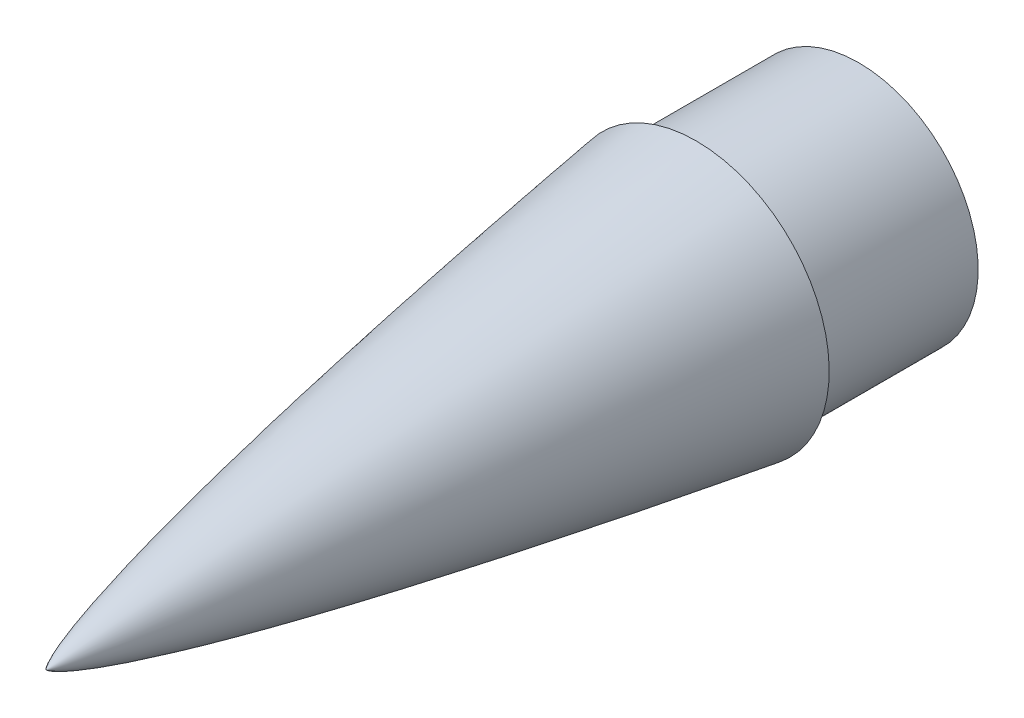
ISO-10303-21;
HEADER;
FILE_DESCRIPTION(('STEP AP214'),'2;1');
FILE_NAME('part.step','',(''),(''),'','','');
FILE_SCHEMA(('AUTOMOTIVE_DESIGN { 1 0 10303 214 1 1 1 1 }'));
ENDSEC;
DATA;
#1=APPLICATION_CONTEXT('core data for automotive mechanical design processes');
#2=APPLICATION_PROTOCOL_DEFINITION('international standard','automotive_design',2000,#1);
#3=PRODUCT_CONTEXT('',#1,'mechanical');
#4=PRODUCT('Part','Part','',(#3));
#5=PRODUCT_RELATED_PRODUCT_CATEGORY('part','',(#4));
#6=PRODUCT_DEFINITION_FORMATION('','',#4);
#7=PRODUCT_DEFINITION_CONTEXT('part definition',#1,'design');
#8=PRODUCT_DEFINITION('design','',#6,#7);
#9=PRODUCT_DEFINITION_SHAPE('','',#8);
#10=(LENGTH_UNIT() NAMED_UNIT(*) SI_UNIT(.MILLI.,.METRE.));
#11=(NAMED_UNIT(*) PLANE_ANGLE_UNIT() SI_UNIT($,.RADIAN.));
#12=(NAMED_UNIT(*) SI_UNIT($,.STERADIAN.) SOLID_ANGLE_UNIT());
#13=UNCERTAINTY_MEASURE_WITH_UNIT(LENGTH_MEASURE(1.E-05),#10,'distance_accuracy_value','');
#14=(GEOMETRIC_REPRESENTATION_CONTEXT(3) GLOBAL_UNCERTAINTY_ASSIGNED_CONTEXT((#13)) GLOBAL_UNIT_ASSIGNED_CONTEXT((#10,
#11,#12)) REPRESENTATION_CONTEXT('',''));
#15=CARTESIAN_POINT('',(0.,0.,0.));
#16=DIRECTION('',(0.,0.,1.));
#17=DIRECTION('',(1.,0.,0.));
#18=AXIS2_PLACEMENT_3D('',#15,#16,#17);
#19=CARTESIAN_POINT('',(0.,15.5799718970339,-76.199999999642));
#20=DIRECTION('',(0.,0.,-1.));
#21=DIRECTION('',(0.,1.,0.));
#22=AXIS2_PLACEMENT_3D('',#19,#20,#21);
#23=PLANE('',#22);
#24=CARTESIAN_POINT('',(0.,0.,-76.199999999642));
#25=DIRECTION('',(0.,0.,-1.));
#26=DIRECTION('',(0.,1.,0.));
#27=AXIS2_PLACEMENT_3D('',#24,#25,#26);
#28=CIRCLE('',#27,15.5799718970339);
#29=CARTESIAN_POINT('',(0.,15.5799718970339,-76.199999999642));
#30=VERTEX_POINT('',#29);
#31=EDGE_CURVE('E11',#30,#30,#28,.T.);
#32=ORIENTED_EDGE('',*,*,#31,.T.);
#33=EDGE_LOOP('',(#32));
#34=FACE_BOUND('',#33,.T.);
#35=CARTESIAN_POINT('',(0.,0.,-76.199999999642));
#36=DIRECTION('',(0.,0.,-1.));
#37=DIRECTION('',(0.,1.,0.));
#38=AXIS2_PLACEMENT_3D('',#35,#36,#37);
#39=CIRCLE('',#38,13.9924718970339);
#40=CARTESIAN_POINT('',(0.,-13.9924718970339,-76.199999999642));
#41=VERTEX_POINT('',#40);
#42=EDGE_CURVE('E60',#41,#41,#39,.T.);
#43=ORIENTED_EDGE('',*,*,#42,.F.);
#44=EDGE_LOOP('',(#43));
#45=FACE_BOUND('',#44,.T.);
#46=ADVANCED_FACE('F36',(#34,#45),#23,.T.);
#47=CARTESIAN_POINT('',(0.,15.5799718969802,-76.1999999995607));
#48=CARTESIAN_POINT('',(0.,15.3895729547036,-74.9155941622268));
#49=CARTESIAN_POINT('',(0.,15.1098954056701,-73.045302384138));
#50=CARTESIAN_POINT('',(0.,14.571062690821,-69.4662667555261));
#51=CARTESIAN_POINT('',(0.,14.1155427481859,-66.5236741117609));
#52=CARTESIAN_POINT('',(0.,13.6316161182916,-63.4013476780819));
#53=CARTESIAN_POINT('',(0.,13.1007254682686,-60.0474196836391));
#54=CARTESIAN_POINT('',(0.,12.4056815193168,-55.7151810860027));
#55=CARTESIAN_POINT('',(0.,11.6042109710699,-50.8558328276285));
#56=CARTESIAN_POINT('',(0.,10.6414581882766,-45.1891653049715));
#57=CARTESIAN_POINT('',(0.,9.65490758054406,-39.5922990944547));
#58=CARTESIAN_POINT('',(0.,8.62415464250781,-33.9648652443164));
#59=CARTESIAN_POINT('',(0.,7.5509991765387,-28.3686298476576));
#60=CARTESIAN_POINT('',(0.,6.41957865392455,-22.7694561290215));
#61=CARTESIAN_POINT('',(0.,5.2178242311914,-17.1940617699618));
#62=CARTESIAN_POINT('',(0.,4.02916325686826,-12.1152956794456));
#63=CARTESIAN_POINT('',(0.,2.93061826910381,-7.88009245411439));
#64=CARTESIAN_POINT('',(0.,2.00048158658457,-4.72381448550034));
#65=CARTESIAN_POINT('',(0.,1.34321372177097,-2.77394700010419));
#66=CARTESIAN_POINT('',(0.,0.897045191267151,-1.61985587368998));
#67=CARTESIAN_POINT('',(0.,0.607778943753491,-0.965070936323735));
#68=CARTESIAN_POINT('',(0.,0.419955079414366,-0.590199778522735));
#69=CARTESIAN_POINT('',(0.,0.296839096215719,-0.371995571645469));
#70=CARTESIAN_POINT('',(0.,0.213097121063092,-0.239336461476345));
#71=CARTESIAN_POINT('',(0.,0.154766635505859,-0.156269016448688));
#72=CARTESIAN_POINT('',(0.,0.110321357090847,-0.0993332711354753));
#73=CARTESIAN_POINT('',(0.,0.0751205760060184,-0.0589856614819635));
#74=CARTESIAN_POINT('',(0.,0.0445406446548689,-0.029052267767927));
#75=CARTESIAN_POINT('',(0.,0.0216391254251348,-0.0101026323858277));
#76=CARTESIAN_POINT('',(0.,0.00751765697148341,-0.0027921327139176));
#77=CARTESIAN_POINT('',(0.,0.,0.));
#78=B_SPLINE_CURVE_WITH_KNOTS('',4,(#47,#48,#49,#50,#51,#52,#53,#54,#55,#56,#57,#58,#59,#60,#61,
#62,#63,#64,#65,#66,#67,#68,#69,#70,#71,#72,#73,#74,#75,#76,#77),.UNSPECIFIED.,.F.,.F.,(5,1,1,1,
1,1,1,1,1,1,1,1,1,1,1,1,1,1,1,1,1,1,1,1,1,1,1,5),(0.,0.066621305169569,0.0999319583453797,
0.13324261152119,0.166553264392778,0.199863917264365,0.26648522274634,0.333106528963266,
0.399727835542182,0.466349141453611,0.53297044755296,0.599591752672604,0.666213054985164,
0.732834364524441,0.799455666919544,0.843028557282287,0.870568298169383,0.886413447873953,
0.895536489864375,0.900776151408608,0.903989060571466,0.905982158817295,0.907232703586552,
0.908098577180957,0.90872644175037,0.909355226337642,0.90972805517767,0.910100884017699),.UNSPECIFIED.);
#79=CARTESIAN_POINT('',(0.,0.,-76.199999999642));
#80=DIRECTION('',(0.,0.,-1.));
#81=AXIS1_PLACEMENT('',#79,#80);
#82=SURFACE_OF_REVOLUTION('',#78,#81);
#83=CARTESIAN_POINT('',(0.,0.,-1.76039734727667E-10));
#84=VERTEX_POINT('',#83);
#85=VERTEX_LOOP('',#84);
#86=FACE_BOUND('',#85,.T.);
#87=ORIENTED_EDGE('',*,*,#31,.F.);
#88=EDGE_LOOP('',(#87));
#89=FACE_BOUND('',#88,.T.);
#90=ADVANCED_FACE('F38',(#86,#89),#82,.F.);
#91=CARTESIAN_POINT('',(0.,0.,-95.249999999642));
#92=DIRECTION('',(0.,0.,1.));
#93=DIRECTION('',(0.,-1.,0.));
#94=AXIS2_PLACEMENT_3D('',#91,#92,#93);
#95=CYLINDRICAL_SURFACE('',#94,13.9924718970339);
#96=CARTESIAN_POINT('',(0.,0.,-95.249999999642));
#97=DIRECTION('',(0.,0.,-1.));
#98=DIRECTION('',(0.,1.,0.));
#99=AXIS2_PLACEMENT_3D('',#96,#97,#98);
#100=CIRCLE('',#99,13.9924718970339);
#101=CARTESIAN_POINT('',(0.,-13.9924718970339,-95.249999999642));
#102=VERTEX_POINT('',#101);
#103=EDGE_CURVE('E44',#102,#102,#100,.T.);
#104=CARTESIAN_POINT('',(0.,-13.9924718970339,-95.249999999642));
#105=CARTESIAN_POINT('',(0.,-13.9924718970339,-95.051562499642));
#106=CARTESIAN_POINT('',(0.,-13.9924718970339,-94.853124999642));
#107=CARTESIAN_POINT('',(0.,-13.9924718970339,-94.456249999642));
#108=CARTESIAN_POINT('',(0.,-13.9924718970339,-94.257812499642));
#109=CARTESIAN_POINT('',(0.,-13.9924718970339,-93.860937499642));
#110=CARTESIAN_POINT('',(0.,-13.9924718970339,-93.662499999642));
#111=CARTESIAN_POINT('',(0.,-13.9924718970339,-93.265624999642));
#112=CARTESIAN_POINT('',(0.,-13.9924718970339,-93.067187499642));
#113=CARTESIAN_POINT('',(0.,-13.9924718970339,-92.670312499642));
#114=CARTESIAN_POINT('',(0.,-13.9924718970339,-92.471874999642));
#115=CARTESIAN_POINT('',(0.,-13.9924718970339,-92.074999999642));
#116=CARTESIAN_POINT('',(0.,-13.9924718970339,-91.876562499642));
#117=CARTESIAN_POINT('',(0.,-13.9924718970339,-91.479687499642));
#118=CARTESIAN_POINT('',(0.,-13.9924718970339,-91.281249999642));
#119=CARTESIAN_POINT('',(0.,-13.9924718970339,-90.884374999642));
#120=CARTESIAN_POINT('',(0.,-13.9924718970339,-90.685937499642));
#121=CARTESIAN_POINT('',(0.,-13.9924718970339,-90.289062499642));
#122=CARTESIAN_POINT('',(0.,-13.9924718970339,-90.090624999642));
#123=CARTESIAN_POINT('',(0.,-13.9924718970339,-89.693749999642));
#124=CARTESIAN_POINT('',(0.,-13.9924718970339,-89.495312499642));
#125=CARTESIAN_POINT('',(0.,-13.9924718970339,-89.098437499642));
#126=CARTESIAN_POINT('',(0.,-13.9924718970339,-88.899999999642));
#127=CARTESIAN_POINT('',(0.,-13.9924718970339,-88.503124999642));
#128=CARTESIAN_POINT('',(0.,-13.9924718970339,-88.304687499642));
#129=CARTESIAN_POINT('',(0.,-13.9924718970339,-87.907812499642));
#130=CARTESIAN_POINT('',(0.,-13.9924718970339,-87.709374999642));
#131=CARTESIAN_POINT('',(0.,-13.9924718970339,-87.312499999642));
#132=CARTESIAN_POINT('',(0.,-13.9924718970339,-87.114062499642));
#133=CARTESIAN_POINT('',(0.,-13.9924718970339,-86.717187499642));
#134=CARTESIAN_POINT('',(0.,-13.9924718970339,-86.518749999642));
#135=CARTESIAN_POINT('',(0.,-13.9924718970339,-86.121874999642));
#136=CARTESIAN_POINT('',(0.,-13.9924718970339,-85.923437499642));
#137=CARTESIAN_POINT('',(0.,-13.9924718970339,-85.526562499642));
#138=CARTESIAN_POINT('',(0.,-13.9924718970339,-85.328124999642));
#139=CARTESIAN_POINT('',(0.,-13.9924718970339,-84.931249999642));
#140=CARTESIAN_POINT('',(0.,-13.9924718970339,-84.732812499642));
#141=CARTESIAN_POINT('',(0.,-13.9924718970339,-84.335937499642));
#142=CARTESIAN_POINT('',(0.,-13.9924718970339,-84.137499999642));
#143=CARTESIAN_POINT('',(0.,-13.9924718970339,-83.740624999642));
#144=CARTESIAN_POINT('',(0.,-13.9924718970339,-83.542187499642));
#145=CARTESIAN_POINT('',(0.,-13.9924718970339,-83.145312499642));
#146=CARTESIAN_POINT('',(0.,-13.9924718970339,-82.946874999642));
#147=CARTESIAN_POINT('',(0.,-13.9924718970339,-82.549999999642));
#148=CARTESIAN_POINT('',(0.,-13.9924718970339,-82.351562499642));
#149=CARTESIAN_POINT('',(0.,-13.9924718970339,-81.954687499642));
#150=CARTESIAN_POINT('',(0.,-13.9924718970339,-81.756249999642));
#151=CARTESIAN_POINT('',(0.,-13.9924718970339,-81.359374999642));
#152=CARTESIAN_POINT('',(0.,-13.9924718970339,-81.160937499642));
#153=CARTESIAN_POINT('',(0.,-13.9924718970339,-80.764062499642));
#154=CARTESIAN_POINT('',(0.,-13.9924718970339,-80.565624999642));
#155=CARTESIAN_POINT('',(0.,-13.9924718970339,-80.168749999642));
#156=CARTESIAN_POINT('',(0.,-13.9924718970339,-79.970312499642));
#157=CARTESIAN_POINT('',(0.,-13.9924718970339,-79.573437499642));
#158=CARTESIAN_POINT('',(0.,-13.9924718970339,-79.374999999642));
#159=CARTESIAN_POINT('',(0.,-13.9924718970339,-78.978124999642));
#160=CARTESIAN_POINT('',(0.,-13.9924718970339,-78.779687499642));
#161=CARTESIAN_POINT('',(0.,-13.9924718970339,-78.382812499642));
#162=CARTESIAN_POINT('',(0.,-13.9924718970339,-78.184374999642));
#163=CARTESIAN_POINT('',(0.,-13.9924718970339,-77.787499999642));
#164=CARTESIAN_POINT('',(0.,-13.9924718970339,-77.589062499642));
#165=CARTESIAN_POINT('',(0.,-13.9924718970339,-77.192187499642));
#166=CARTESIAN_POINT('',(0.,-13.9924718970339,-76.993749999642));
#167=CARTESIAN_POINT('',(0.,-13.9924718970339,-76.596874999642));
#168=CARTESIAN_POINT('',(0.,-13.9924718970339,-76.398437499642));
#169=CARTESIAN_POINT('',(0.,-13.9924718970339,-76.199999999642));
#170=B_SPLINE_CURVE_WITH_KNOTS('',3,(#104,#105,#106,#107,#108,#109,#110,#111,#112,#113,#114,
#115,#116,#117,#118,#119,#120,#121,#122,#123,#124,#125,#126,#127,#128,#129,#130,#131,#132,#133,
#134,#135,#136,#137,#138,#139,#140,#141,#142,#143,#144,#145,#146,#147,#148,#149,#150,#151,#152,
#153,#154,#155,#156,#157,#158,#159,#160,#161,#162,#163,#164,#165,#166,#167,#168,#169),
.UNSPECIFIED.,.F.,.F.,(4,2,2,2,2,2,2,2,2,2,2,2,2,2,2,2,2,2,2,2,2,2,2,2,2,2,2,2,2,2,2,2,4),(0.,
0.595312499999986,1.19062499999999,1.78593749999999,2.38124999999999,2.97656249999999,
3.57187499999999,4.16718749999999,4.76249999999999,5.35781249999999,5.95312499999999,
6.54843749999999,7.14374999999999,7.73906249999999,8.33437499999999,8.92968749999999,
9.52499999999999,10.1203125,10.715625,11.3109375,11.90625,12.5015625,13.096875,13.6921875,
14.2875,14.8828125,15.478125,16.0734375,16.66875,17.2640625,17.859375,18.4546875,19.05),.UNSPECIFIED.);
#171=EDGE_CURVE('BSEAM78',#102,#41,#170,.T.);
#172=ORIENTED_EDGE('',*,*,#103,.F.);
#173=ORIENTED_EDGE('',*,*,#42,.T.);
#174=ORIENTED_EDGE('',*,*,#171,.T.);
#175=ORIENTED_EDGE('',*,*,#171,.F.);
#176=EDGE_LOOP('',(#172,#174,#173,#175));
#177=FACE_BOUND('',#176,.T.);
#178=ADVANCED_FACE('F78',(#177),#95,.T.);
#179=CARTESIAN_POINT('',(0.,0.,-95.249999999642));
#180=DIRECTION('',(0.,0.,-1.));
#181=DIRECTION('',(0.,1.,0.));
#182=AXIS2_PLACEMENT_3D('',#179,#180,#181);
#183=PLANE('',#182);
#184=CARTESIAN_POINT('',(0.,0.,-95.249999999642));
#185=DIRECTION('',(0.,0.,-1.));
#186=DIRECTION('',(0.,1.,0.));
#187=AXIS2_PLACEMENT_3D('',#184,#185,#186);
#188=CIRCLE('',#187,2.5527);
#189=CARTESIAN_POINT('',(0.,2.55270000000001,-95.249999999642));
#190=VERTEX_POINT('',#189);
#191=EDGE_CURVE('E61',#190,#190,#188,.T.);
#192=ORIENTED_EDGE('',*,*,#191,.F.);
#193=EDGE_LOOP('',(#192));
#194=FACE_BOUND('',#193,.T.);
#195=ORIENTED_EDGE('',*,*,#103,.T.);
#196=EDGE_LOOP('',(#195));
#197=FACE_BOUND('',#196,.T.);
#198=ADVANCED_FACE('F54',(#194,#197),#183,.T.);
#199=CARTESIAN_POINT('',(0.,0.,-57.149999999642));
#200=DIRECTION('',(0.,0.,-1.));
#201=DIRECTION('',(0.,1.,0.));
#202=AXIS2_PLACEMENT_3D('',#199,#200,#201);
#203=CONICAL_SURFACE('',#202,2.55269999999999,1.02974425867665);
#204=CARTESIAN_POINT('',(0.,0.,-55.6161830974503));
#205=VERTEX_POINT('',#204);
#206=VERTEX_LOOP('',#205);
#207=FACE_BOUND('',#206,.T.);
#208=CARTESIAN_POINT('',(0.,0.,-57.149999999642));
#209=DIRECTION('',(0.,0.,-1.));
#210=DIRECTION('',(0.,1.,0.));
#211=AXIS2_PLACEMENT_3D('',#208,#209,#210);
#212=CIRCLE('',#211,2.55269999999999);
#213=CARTESIAN_POINT('',(0.,2.5527,-57.149999999642));
#214=VERTEX_POINT('',#213);
#215=EDGE_CURVE('E58',#214,#214,#212,.T.);
#216=ORIENTED_EDGE('',*,*,#215,.T.);
#217=EDGE_LOOP('',(#216));
#218=FACE_BOUND('',#217,.T.);
#219=ADVANCED_FACE('F50',(#207,#218),#203,.F.);
#220=CARTESIAN_POINT('',(0.,0.,-95.249999999642));
#221=DIRECTION('',(0.,0.,-1.));
#222=DIRECTION('',(0.,1.,0.));
#223=AXIS2_PLACEMENT_3D('',#220,#221,#222);
#224=CYLINDRICAL_SURFACE('',#223,2.5527);
#225=ORIENTED_EDGE('',*,*,#215,.F.);
#226=EDGE_LOOP('',(#225));
#227=FACE_BOUND('',#226,.T.);
#228=ORIENTED_EDGE('',*,*,#191,.T.);
#229=EDGE_LOOP('',(#228));
#230=FACE_BOUND('',#229,.T.);
#231=ADVANCED_FACE('F53',(#227,#230),#224,.F.);
#232=CLOSED_SHELL('',(#46,#90,#178,#198,#219,#231));
#233=MANIFOLD_SOLID_BREP('B2',#232);
#234=ADVANCED_BREP_SHAPE_REPRESENTATION('',(#18,#233),#14);
#235=SHAPE_DEFINITION_REPRESENTATION(#9,#234);
ENDSEC;
END-ISO-10303-21;
